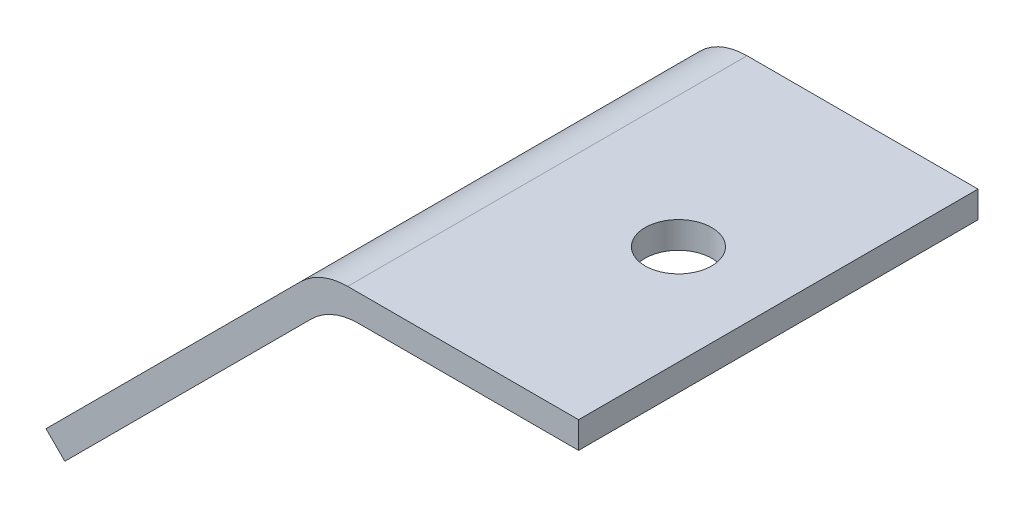
ISO-10303-21;
HEADER;
FILE_DESCRIPTION(('STEP AP214'),'2;1');
FILE_NAME('part.step','',(''),(''),'','','');
FILE_SCHEMA(('AUTOMOTIVE_DESIGN { 1 0 10303 214 1 1 1 1 }'));
ENDSEC;
DATA;
#1=APPLICATION_CONTEXT('core data for automotive mechanical design processes');
#2=APPLICATION_PROTOCOL_DEFINITION('international standard','automotive_design',2000,#1);
#3=PRODUCT_CONTEXT('',#1,'mechanical');
#4=PRODUCT('Part','Part','',(#3));
#5=PRODUCT_RELATED_PRODUCT_CATEGORY('part','',(#4));
#6=PRODUCT_DEFINITION_FORMATION('','',#4);
#7=PRODUCT_DEFINITION_CONTEXT('part definition',#1,'design');
#8=PRODUCT_DEFINITION('design','',#6,#7);
#9=PRODUCT_DEFINITION_SHAPE('','',#8);
#10=(LENGTH_UNIT() NAMED_UNIT(*) SI_UNIT(.MILLI.,.METRE.));
#11=(NAMED_UNIT(*) PLANE_ANGLE_UNIT() SI_UNIT($,.RADIAN.));
#12=(NAMED_UNIT(*) SI_UNIT($,.STERADIAN.) SOLID_ANGLE_UNIT());
#13=UNCERTAINTY_MEASURE_WITH_UNIT(LENGTH_MEASURE(1.E-05),#10,'distance_accuracy_value','');
#14=(GEOMETRIC_REPRESENTATION_CONTEXT(3) GLOBAL_UNCERTAINTY_ASSIGNED_CONTEXT((#13)) GLOBAL_UNIT_ASSIGNED_CONTEXT((#10,
#11,#12)) REPRESENTATION_CONTEXT('',''));
#15=CARTESIAN_POINT('',(0.,0.,0.));
#16=DIRECTION('',(0.,0.,1.));
#17=DIRECTION('',(1.,0.,0.));
#18=AXIS2_PLACEMENT_3D('',#15,#16,#17);
#19=CARTESIAN_POINT('',(-45.1874014837275,31.1715728752538,60.));
#20=DIRECTION('',(0.707106781186549,-0.707106781186546,0.));
#21=DIRECTION('',(0.707106781186546,0.707106781186549,0.));
#22=AXIS2_PLACEMENT_3D('',#19,#20,#21);
#23=PLANE('',#22);
#24=DIRECTION('',(-0.707106781186546,-0.707106781186549,0.));
#25=VECTOR('',#24,1.);
#26=CARTESIAN_POINT('',(-45.1874014837275,31.1715728752538,60.));
#27=LINE('',#26,#25);
#28=CARTESIAN_POINT('',(-48.116333671862,28.2426406871193,60.));
#29=VERTEX_POINT('',#28);
#30=CARTESIAN_POINT('',(-86.3589743589811,-10.,60.));
#31=VERTEX_POINT('',#30);
#32=EDGE_CURVE('E100',#29,#31,#27,.T.);
#33=ORIENTED_EDGE('',*,*,#32,.F.);
#34=DIRECTION('',(0.,0.,-1.));
#35=VECTOR('',#34,1.);
#36=CARTESIAN_POINT('',(-48.116333671862,28.2426406871193,60.));
#37=LINE('',#36,#35);
#38=CARTESIAN_POINT('',(-48.116333671862,28.2426406871193,0.));
#39=VERTEX_POINT('',#38);
#40=EDGE_CURVE('E135',#29,#39,#37,.T.);
#41=ORIENTED_EDGE('',*,*,#40,.T.);
#42=DIRECTION('',(-0.707106781186546,-0.707106781186549,0.));
#43=VECTOR('',#42,1.);
#44=CARTESIAN_POINT('',(-45.1874014837275,31.1715728752538,0.));
#45=LINE('',#44,#43);
#46=CARTESIAN_POINT('',(-86.3589743589811,-10.,0.));
#47=VERTEX_POINT('',#46);
#48=EDGE_CURVE('E123',#39,#47,#45,.T.);
#49=ORIENTED_EDGE('',*,*,#48,.T.);
#50=DIRECTION('',(0.,0.,-1.));
#51=VECTOR('',#50,1.);
#52=CARTESIAN_POINT('',(-86.3589743589811,-10.,60.));
#53=LINE('',#52,#51);
#54=EDGE_CURVE('E117',#31,#47,#53,.T.);
#55=ORIENTED_EDGE('',*,*,#54,.F.);
#56=EDGE_LOOP('',(#33,#41,#49,#55));
#57=FACE_BOUND('',#56,.T.);
#58=ADVANCED_FACE('F35',(#57),#23,.F.);
#59=CARTESIAN_POINT('',(-86.3589743589811,-10.,60.));
#60=DIRECTION('',(0.707106781186546,0.707106781186549,0.));
#61=DIRECTION('',(-0.707106781186549,0.707106781186546,0.));
#62=AXIS2_PLACEMENT_3D('',#59,#60,#61);
#63=PLANE('',#62);
#64=DIRECTION('',(0.707106781186549,-0.707106781186546,0.));
#65=VECTOR('',#64,1.);
#66=CARTESIAN_POINT('',(-86.3589743589811,-10.,0.));
#67=LINE('',#66,#65);
#68=CARTESIAN_POINT('',(-83.5305472342349,-12.8284271247462,0.));
#69=VERTEX_POINT('',#68);
#70=EDGE_CURVE('E151',#47,#69,#67,.T.);
#71=ORIENTED_EDGE('',*,*,#70,.T.);
#72=DIRECTION('',(0.,0.,-1.));
#73=VECTOR('',#72,1.);
#74=CARTESIAN_POINT('',(-83.5305472342349,-12.8284271247462,60.));
#75=LINE('',#74,#73);
#76=CARTESIAN_POINT('',(-83.5305472342349,-12.8284271247462,60.));
#77=VERTEX_POINT('',#76);
#78=EDGE_CURVE('E119',#77,#69,#75,.T.);
#79=ORIENTED_EDGE('',*,*,#78,.F.);
#80=DIRECTION('',(0.707106781186549,-0.707106781186546,0.));
#81=VECTOR('',#80,1.);
#82=CARTESIAN_POINT('',(-86.3589743589811,-10.,60.));
#83=LINE('',#82,#81);
#84=EDGE_CURVE('E104',#31,#77,#83,.T.);
#85=ORIENTED_EDGE('',*,*,#84,.F.);
#86=ORIENTED_EDGE('',*,*,#54,.T.);
#87=EDGE_LOOP('',(#71,#79,#85,#86));
#88=FACE_BOUND('',#87,.T.);
#89=ADVANCED_FACE('F116',(#88),#63,.F.);
#90=CARTESIAN_POINT('',(-83.5305472342349,-12.8284271247462,60.));
#91=DIRECTION('',(-0.707106781186549,0.707106781186546,0.));
#92=DIRECTION('',(-0.707106781186546,-0.707106781186549,0.));
#93=AXIS2_PLACEMENT_3D('',#90,#91,#92);
#94=PLANE('',#93);
#95=DIRECTION('',(0.707106781186546,0.707106781186549,0.));
#96=VECTOR('',#95,1.);
#97=CARTESIAN_POINT('',(-83.5305472342349,-12.8284271247462,0.));
#98=LINE('',#97,#96);
#99=CARTESIAN_POINT('',(-46.4594794223696,24.2426406871193,0.));
#100=VERTEX_POINT('',#99);
#101=EDGE_CURVE('E143',#69,#100,#98,.T.);
#102=ORIENTED_EDGE('',*,*,#101,.T.);
#103=DIRECTION('',(0.,0.,-1.));
#104=VECTOR('',#103,1.);
#105=CARTESIAN_POINT('',(-46.4594794223696,24.2426406871193,60.));
#106=LINE('',#105,#104);
#107=CARTESIAN_POINT('',(-46.4594794223696,24.2426406871193,60.));
#108=VERTEX_POINT('',#107);
#109=EDGE_CURVE('E128',#100,#108,#106,.F.);
#110=ORIENTED_EDGE('',*,*,#109,.T.);
#111=DIRECTION('',(0.707106781186546,0.707106781186549,0.));
#112=VECTOR('',#111,1.);
#113=CARTESIAN_POINT('',(-83.5305472342349,-12.8284271247462,60.));
#114=LINE('',#113,#112);
#115=EDGE_CURVE('E121',#77,#108,#114,.T.);
#116=ORIENTED_EDGE('',*,*,#115,.F.);
#117=ORIENTED_EDGE('',*,*,#78,.T.);
#118=EDGE_LOOP('',(#102,#110,#116,#117));
#119=FACE_BOUND('',#118,.T.);
#120=ADVANCED_FACE('F150',(#119),#94,.F.);
#121=CARTESIAN_POINT('',(-43.5305472342351,27.1715728752538,60.));
#122=DIRECTION('',(0.,1.,0.));
#123=DIRECTION('',(0.,0.,1.));
#124=AXIS2_PLACEMENT_3D('',#121,#122,#123);
#125=PLANE('',#124);
#126=CARTESIAN_POINT('',(-21.3589743589811,27.1715728752538,30.));
#127=DIRECTION('',(0.,1.,0.));
#128=DIRECTION('',(0.,0.,1.));
#129=AXIS2_PLACEMENT_3D('',#126,#127,#128);
#130=CIRCLE('',#129,5.);
#131=CARTESIAN_POINT('',(-21.3589743589811,27.1715728752538,35.));
#132=VERTEX_POINT('',#131);
#133=EDGE_CURVE('E171',#132,#132,#130,.T.);
#134=ORIENTED_EDGE('',*,*,#133,.T.);
#135=EDGE_LOOP('',(#134));
#136=FACE_BOUND('',#135,.T.);
#137=DIRECTION('',(1.,0.,0.));
#138=VECTOR('',#137,1.);
#139=CARTESIAN_POINT('',(-43.5305472342351,27.1715728752538,60.));
#140=LINE('',#139,#138);
#141=CARTESIAN_POINT('',(-39.3884116105041,27.1715728752538,60.));
#142=VERTEX_POINT('',#141);
#143=CARTESIAN_POINT('',(-6.35897435898108,27.1715728752538,60.));
#144=VERTEX_POINT('',#143);
#145=EDGE_CURVE('E156',#142,#144,#140,.T.);
#146=ORIENTED_EDGE('',*,*,#145,.F.);
#147=DIRECTION('',(0.,0.,-1.));
#148=VECTOR('',#147,1.);
#149=CARTESIAN_POINT('',(-39.3884116105041,27.1715728752538,0.));
#150=LINE('',#149,#148);
#151=CARTESIAN_POINT('',(-39.3884116105041,27.1715728752538,0.));
#152=VERTEX_POINT('',#151);
#153=EDGE_CURVE('E125',#142,#152,#150,.T.);
#154=ORIENTED_EDGE('',*,*,#153,.T.);
#155=DIRECTION('',(1.,0.,0.));
#156=VECTOR('',#155,1.);
#157=CARTESIAN_POINT('',(-43.5305472342351,27.1715728752538,0.));
#158=LINE('',#157,#156);
#159=CARTESIAN_POINT('',(-6.35897435898108,27.1715728752538,0.));
#160=VERTEX_POINT('',#159);
#161=EDGE_CURVE('E145',#152,#160,#158,.T.);
#162=ORIENTED_EDGE('',*,*,#161,.T.);
#163=DIRECTION('',(0.,0.,-1.));
#164=VECTOR('',#163,1.);
#165=CARTESIAN_POINT('',(-6.35897435898108,27.1715728752538,60.));
#166=LINE('',#165,#164);
#167=EDGE_CURVE('E130',#144,#160,#166,.T.);
#168=ORIENTED_EDGE('',*,*,#167,.F.);
#169=EDGE_LOOP('',(#146,#154,#162,#168));
#170=FACE_BOUND('',#169,.T.);
#171=ADVANCED_FACE('F159',(#136,#170),#125,.F.);
#172=CARTESIAN_POINT('',(-6.35897435898108,27.1715728752538,60.));
#173=DIRECTION('',(-1.,0.,0.));
#174=DIRECTION('',(0.,-1.,0.));
#175=AXIS2_PLACEMENT_3D('',#172,#173,#174);
#176=PLANE('',#175);
#177=DIRECTION('',(0.,1.,0.));
#178=VECTOR('',#177,1.);
#179=CARTESIAN_POINT('',(-6.35897435898108,27.1715728752538,0.));
#180=LINE('',#179,#178);
#181=CARTESIAN_POINT('',(-6.35897435898108,31.1715728752538,0.));
#182=VERTEX_POINT('',#181);
#183=EDGE_CURVE('E174',#160,#182,#180,.T.);
#184=ORIENTED_EDGE('',*,*,#183,.T.);
#185=DIRECTION('',(0.,0.,-1.));
#186=VECTOR('',#185,1.);
#187=CARTESIAN_POINT('',(-6.35897435898108,31.1715728752538,60.));
#188=LINE('',#187,#186);
#189=CARTESIAN_POINT('',(-6.35897435898108,31.1715728752538,60.));
#190=VERTEX_POINT('',#189);
#191=EDGE_CURVE('E169',#190,#182,#188,.T.);
#192=ORIENTED_EDGE('',*,*,#191,.F.);
#193=DIRECTION('',(0.,1.,0.));
#194=VECTOR('',#193,1.);
#195=CARTESIAN_POINT('',(-6.35897435898108,27.1715728752538,60.));
#196=LINE('',#195,#194);
#197=EDGE_CURVE('E162',#144,#190,#196,.T.);
#198=ORIENTED_EDGE('',*,*,#197,.F.);
#199=ORIENTED_EDGE('',*,*,#167,.T.);
#200=EDGE_LOOP('',(#184,#192,#198,#199));
#201=FACE_BOUND('',#200,.T.);
#202=ADVANCED_FACE('F179',(#201),#176,.F.);
#203=CARTESIAN_POINT('',(-6.35897435898108,31.1715728752538,60.));
#204=DIRECTION('',(0.,-1.,0.));
#205=DIRECTION('',(1.,0.,0.));
#206=AXIS2_PLACEMENT_3D('',#203,#204,#205);
#207=PLANE('',#206);
#208=CARTESIAN_POINT('',(-21.3589743589811,31.1715728752538,30.));
#209=DIRECTION('',(0.,1.,0.));
#210=DIRECTION('',(-1.,0.,0.));
#211=AXIS2_PLACEMENT_3D('',#208,#209,#210);
#212=CIRCLE('',#211,5.);
#213=CARTESIAN_POINT('',(-26.3589743589811,31.1715728752538,30.));
#214=VERTEX_POINT('',#213);
#215=EDGE_CURVE('E275',#214,#214,#212,.T.);
#216=ORIENTED_EDGE('',*,*,#215,.F.);
#217=EDGE_LOOP('',(#216));
#218=FACE_BOUND('',#217,.T.);
#219=DIRECTION('',(-1.,0.,0.));
#220=VECTOR('',#219,1.);
#221=CARTESIAN_POINT('',(-6.35897435898108,31.1715728752538,0.));
#222=LINE('',#221,#220);
#223=CARTESIAN_POINT('',(-41.0452658599965,31.1715728752538,0.));
#224=VERTEX_POINT('',#223);
#225=EDGE_CURVE('E112',#182,#224,#222,.T.);
#226=ORIENTED_EDGE('',*,*,#225,.T.);
#227=DIRECTION('',(0.,0.,-1.));
#228=VECTOR('',#227,1.);
#229=CARTESIAN_POINT('',(-41.0452658599965,31.1715728752538,60.));
#230=LINE('',#229,#228);
#231=CARTESIAN_POINT('',(-41.0452658599965,31.1715728752538,60.));
#232=VERTEX_POINT('',#231);
#233=EDGE_CURVE('E50',#224,#232,#230,.F.);
#234=ORIENTED_EDGE('',*,*,#233,.T.);
#235=DIRECTION('',(-1.,0.,0.));
#236=VECTOR('',#235,1.);
#237=CARTESIAN_POINT('',(-6.35897435898108,31.1715728752538,60.));
#238=LINE('',#237,#236);
#239=EDGE_CURVE('E164',#190,#232,#238,.T.);
#240=ORIENTED_EDGE('',*,*,#239,.F.);
#241=ORIENTED_EDGE('',*,*,#191,.T.);
#242=EDGE_LOOP('',(#226,#234,#240,#241));
#243=FACE_BOUND('',#242,.T.);
#244=ADVANCED_FACE('F181',(#218,#243),#207,.F.);
#245=CARTESIAN_POINT('',(0.,0.,60.));
#246=DIRECTION('',(0.,0.,1.));
#247=DIRECTION('',(1.,0.,0.));
#248=AXIS2_PLACEMENT_3D('',#245,#246,#247);
#249=PLANE('',#248);
#250=ORIENTED_EDGE('',*,*,#239,.T.);
#251=CARTESIAN_POINT('',(-41.0452658599965,21.1715728752538,60.));
#252=DIRECTION('',(0.,0.,1.));
#253=DIRECTION('',(1.,0.,0.));
#254=AXIS2_PLACEMENT_3D('',#251,#252,#253);
#255=CIRCLE('',#254,10.);
#256=EDGE_CURVE('E107',#232,#29,#255,.T.);
#257=ORIENTED_EDGE('',*,*,#256,.T.);
#258=ORIENTED_EDGE('',*,*,#32,.T.);
#259=ORIENTED_EDGE('',*,*,#84,.T.);
#260=ORIENTED_EDGE('',*,*,#115,.T.);
#261=CARTESIAN_POINT('',(-39.3884116105041,17.1715728752538,60.));
#262=DIRECTION('',(0.,0.,1.));
#263=DIRECTION('',(1.,0.,0.));
#264=AXIS2_PLACEMENT_3D('',#261,#262,#263);
#265=CIRCLE('',#264,10.);
#266=EDGE_CURVE('E11',#108,#142,#265,.F.);
#267=ORIENTED_EDGE('',*,*,#266,.T.);
#268=ORIENTED_EDGE('',*,*,#145,.T.);
#269=ORIENTED_EDGE('',*,*,#197,.T.);
#270=EDGE_LOOP('',(#250,#257,#258,#259,#260,#267,#268,#269));
#271=FACE_BOUND('',#270,.T.);
#272=ADVANCED_FACE('F102',(#271),#249,.T.);
#273=CARTESIAN_POINT('',(0.,0.,0.));
#274=DIRECTION('',(0.,0.,1.));
#275=DIRECTION('',(1.,0.,0.));
#276=AXIS2_PLACEMENT_3D('',#273,#274,#275);
#277=PLANE('',#276);
#278=ORIENTED_EDGE('',*,*,#48,.F.);
#279=CARTESIAN_POINT('',(-41.0452658599965,21.1715728752538,0.));
#280=DIRECTION('',(0.,0.,1.));
#281=DIRECTION('',(1.,0.,0.));
#282=AXIS2_PLACEMENT_3D('',#279,#280,#281);
#283=CIRCLE('',#282,10.);
#284=EDGE_CURVE('E58',#39,#224,#283,.F.);
#285=ORIENTED_EDGE('',*,*,#284,.T.);
#286=ORIENTED_EDGE('',*,*,#225,.F.);
#287=ORIENTED_EDGE('',*,*,#183,.F.);
#288=ORIENTED_EDGE('',*,*,#161,.F.);
#289=CARTESIAN_POINT('',(-39.3884116105041,17.1715728752538,0.));
#290=DIRECTION('',(0.,0.,1.));
#291=DIRECTION('',(1.,0.,0.));
#292=AXIS2_PLACEMENT_3D('',#289,#290,#291);
#293=CIRCLE('',#292,10.);
#294=EDGE_CURVE('E43',#152,#100,#293,.T.);
#295=ORIENTED_EDGE('',*,*,#294,.T.);
#296=ORIENTED_EDGE('',*,*,#101,.F.);
#297=ORIENTED_EDGE('',*,*,#70,.F.);
#298=EDGE_LOOP('',(#278,#285,#286,#287,#288,#295,#296,#297));
#299=FACE_BOUND('',#298,.T.);
#300=ADVANCED_FACE('F142',(#299),#277,.F.);
#301=CARTESIAN_POINT('',(-39.3884116105041,17.1715728752538,60.));
#302=DIRECTION('',(0.,0.,1.));
#303=DIRECTION('',(1.,0.,0.));
#304=AXIS2_PLACEMENT_3D('',#301,#302,#303);
#305=CYLINDRICAL_SURFACE('',#304,10.);
#306=ORIENTED_EDGE('',*,*,#266,.F.);
#307=ORIENTED_EDGE('',*,*,#109,.F.);
#308=ORIENTED_EDGE('',*,*,#294,.F.);
#309=ORIENTED_EDGE('',*,*,#153,.F.);
#310=EDGE_LOOP('',(#306,#307,#308,#309));
#311=FACE_BOUND('',#310,.T.);
#312=ADVANCED_FACE('F154',(#311),#305,.F.);
#313=CARTESIAN_POINT('',(-41.0452658599965,21.1715728752538,60.));
#314=DIRECTION('',(0.,0.,-1.));
#315=DIRECTION('',(-1.,0.,0.));
#316=AXIS2_PLACEMENT_3D('',#313,#314,#315);
#317=CYLINDRICAL_SURFACE('',#316,10.);
#318=ORIENTED_EDGE('',*,*,#256,.F.);
#319=ORIENTED_EDGE('',*,*,#233,.F.);
#320=ORIENTED_EDGE('',*,*,#284,.F.);
#321=ORIENTED_EDGE('',*,*,#40,.F.);
#322=EDGE_LOOP('',(#318,#319,#320,#321));
#323=FACE_BOUND('',#322,.T.);
#324=ADVANCED_FACE('F37',(#323),#317,.T.);
#325=CARTESIAN_POINT('',(-21.3589743589811,-28.8284271247462,30.));
#326=DIRECTION('',(0.,1.,0.));
#327=DIRECTION('',(-1.,0.,0.));
#328=AXIS2_PLACEMENT_3D('',#325,#326,#327);
#329=CYLINDRICAL_SURFACE('',#328,5.);
#330=ORIENTED_EDGE('',*,*,#215,.T.);
#331=EDGE_LOOP('',(#330));
#332=FACE_BOUND('',#331,.T.);
#333=ORIENTED_EDGE('',*,*,#133,.F.);
#334=EDGE_LOOP('',(#333));
#335=FACE_BOUND('',#334,.T.);
#336=ADVANCED_FACE('F184',(#332,#335),#329,.F.);
#337=CLOSED_SHELL('',(#58,#89,#120,#171,#202,#244,#272,#300,#312,#324,#336));
#338=MANIFOLD_SOLID_BREP('B2',#337);
#339=ADVANCED_BREP_SHAPE_REPRESENTATION('',(#18,#338),#14);
#340=SHAPE_DEFINITION_REPRESENTATION(#9,#339);
ENDSEC;
END-ISO-10303-21;
